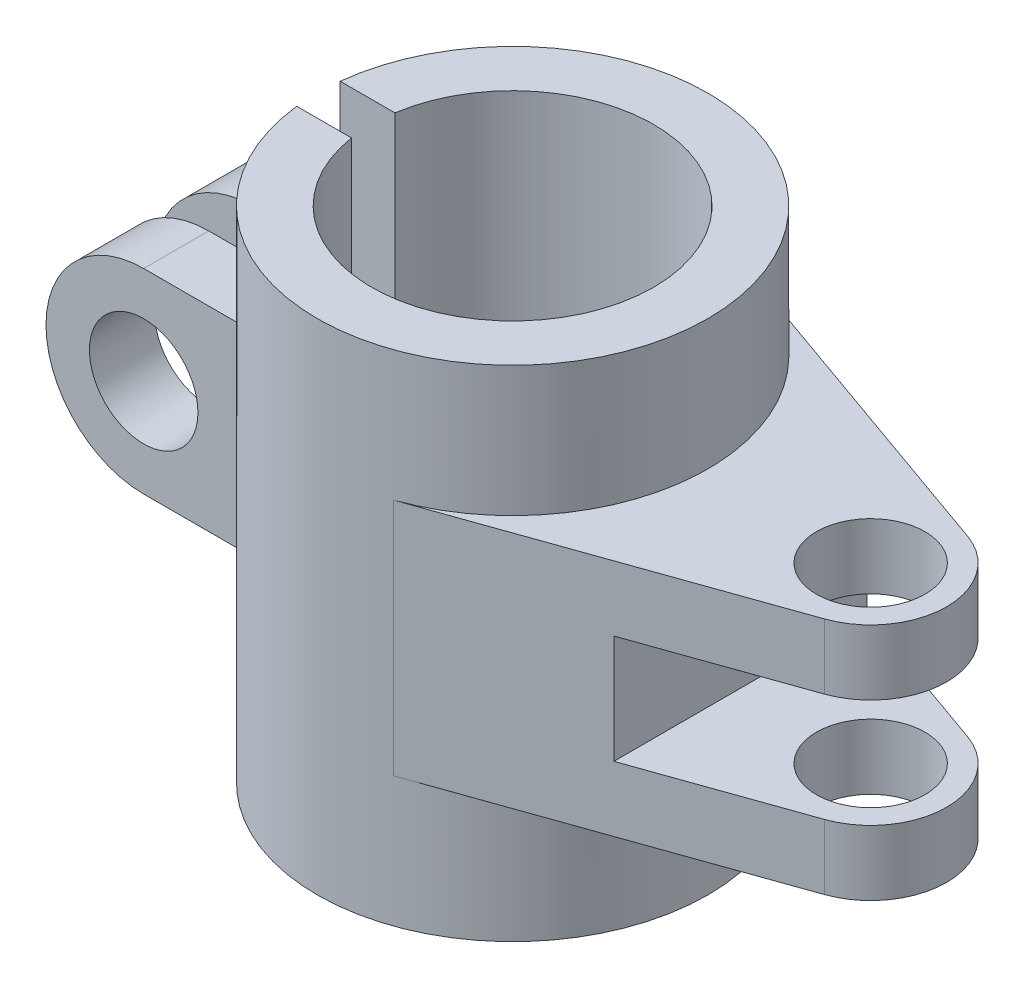
ISO-10303-21;
HEADER;
FILE_DESCRIPTION(('STEP AP214'),'2;1');
FILE_NAME('part.step','',(''),(''),'','','');
FILE_SCHEMA(('AUTOMOTIVE_DESIGN { 1 0 10303 214 1 1 1 1 }'));
ENDSEC;
DATA;
#1=APPLICATION_CONTEXT('core data for automotive mechanical design processes');
#2=APPLICATION_PROTOCOL_DEFINITION('international standard','automotive_design',2000,#1);
#3=PRODUCT_CONTEXT('',#1,'mechanical');
#4=PRODUCT('Part','Part','',(#3));
#5=PRODUCT_RELATED_PRODUCT_CATEGORY('part','',(#4));
#6=PRODUCT_DEFINITION_FORMATION('','',#4);
#7=PRODUCT_DEFINITION_CONTEXT('part definition',#1,'design');
#8=PRODUCT_DEFINITION('design','',#6,#7);
#9=PRODUCT_DEFINITION_SHAPE('','',#8);
#10=(LENGTH_UNIT() NAMED_UNIT(*) SI_UNIT(.MILLI.,.METRE.));
#11=(NAMED_UNIT(*) PLANE_ANGLE_UNIT() SI_UNIT($,.RADIAN.));
#12=(NAMED_UNIT(*) SI_UNIT($,.STERADIAN.) SOLID_ANGLE_UNIT());
#13=UNCERTAINTY_MEASURE_WITH_UNIT(LENGTH_MEASURE(1.E-05),#10,'distance_accuracy_value','');
#14=(GEOMETRIC_REPRESENTATION_CONTEXT(3) GLOBAL_UNCERTAINTY_ASSIGNED_CONTEXT((#13)) GLOBAL_UNIT_ASSIGNED_CONTEXT((#10,
#11,#12)) REPRESENTATION_CONTEXT('',''));
#15=CARTESIAN_POINT('',(0.,0.,0.));
#16=DIRECTION('',(0.,0.,1.));
#17=DIRECTION('',(1.,0.,0.));
#18=AXIS2_PLACEMENT_3D('',#15,#16,#17);
#19=CARTESIAN_POINT('',(120.655483362095,-12.,96.4309872342382));
#20=DIRECTION('',(0.,1.,0.));
#21=DIRECTION('',(0.,0.,1.));
#22=AXIS2_PLACEMENT_3D('',#19,#20,#21);
#23=PLANE('',#22);
#24=DIRECTION('',(0.942809041582064,0.,0.333333333333333));
#25=VECTOR('',#24,1.);
#26=CARTESIAN_POINT('',(111.067814877742,-12.,79.4604244857611));
#27=LINE('',#26,#25);
#28=CARTESIAN_POINT('',(111.067814877742,-12.,79.4604244857611));
#29=VERTEX_POINT('',#28);
#30=CARTESIAN_POINT('',(140.401148211075,-12.,89.8313239431638));
#31=VERTEX_POINT('',#30);
#32=EDGE_CURVE('E23',#29,#31,#27,.T.);
#33=ORIENTED_EDGE('',*,*,#32,.F.);
#34=CARTESIAN_POINT('',(105.067814877742,-12.,96.4309872342382));
#35=DIRECTION('',(0.,1.,0.));
#36=DIRECTION('',(0.333333333333332,0.,0.942809041582064));
#37=AXIS2_PLACEMENT_3D('',#34,#35,#36);
#38=CIRCLE('',#37,18.);
#39=CARTESIAN_POINT('',(111.067814877742,-12.,113.401549982715));
#40=VERTEX_POINT('',#39);
#41=EDGE_CURVE('E183',#40,#29,#38,.T.);
#42=ORIENTED_EDGE('',*,*,#41,.F.);
#43=DIRECTION('',(-0.942809041582063,0.,0.333333333333333));
#44=VECTOR('',#43,1.);
#45=CARTESIAN_POINT('',(140.401148211075,-12.,103.030650525313));
#46=LINE('',#45,#44);
#47=CARTESIAN_POINT('',(140.401148211075,-12.,103.030650525313));
#48=VERTEX_POINT('',#47);
#49=EDGE_CURVE('E345',#48,#40,#46,.T.);
#50=ORIENTED_EDGE('',*,*,#49,.F.);
#51=CARTESIAN_POINT('',(138.067814877742,-12.,96.4309872342382));
#52=DIRECTION('',(0.,-1.,0.));
#53=DIRECTION('',(0.333333333333339,0.,-0.942809041582062));
#54=AXIS2_PLACEMENT_3D('',#51,#52,#53);
#55=CIRCLE('',#54,7.);
#56=EDGE_CURVE('E264',#31,#48,#55,.T.);
#57=ORIENTED_EDGE('',*,*,#56,.F.);
#58=EDGE_LOOP('',(#33,#42,#50,#57));
#59=FACE_BOUND('',#58,.T.);
#60=CARTESIAN_POINT('',(138.067814877742,-12.,96.4309872342382));
#61=DIRECTION('',(0.,1.,0.));
#62=DIRECTION('',(1.,0.,0.));
#63=AXIS2_PLACEMENT_3D('',#60,#61,#62);
#64=CIRCLE('',#63,5.);
#65=CARTESIAN_POINT('',(133.067814877742,-12.,96.4309872342382));
#66=VERTEX_POINT('',#65);
#67=EDGE_CURVE('E256',#66,#66,#64,.T.);
#68=ORIENTED_EDGE('',*,*,#67,.F.);
#69=EDGE_LOOP('',(#68));
#70=FACE_BOUND('',#69,.T.);
#71=ADVANCED_FACE('F15',(#59,#70),#23,.T.);
#72=CARTESIAN_POINT('',(120.655483362095,-34.,96.4309872342382));
#73=DIRECTION('',(0.,1.,0.));
#74=DIRECTION('',(0.,0.,1.));
#75=AXIS2_PLACEMENT_3D('',#72,#73,#74);
#76=PLANE('',#75);
#77=DIRECTION('',(0.942809041582064,0.,0.333333333333333));
#78=VECTOR('',#77,1.);
#79=CARTESIAN_POINT('',(111.067814877742,-34.,79.4604244857611));
#80=LINE('',#79,#78);
#81=CARTESIAN_POINT('',(111.067814877742,-34.,79.4604244857611));
#82=VERTEX_POINT('',#81);
#83=CARTESIAN_POINT('',(140.401148211075,-34.,89.8313239431638));
#84=VERTEX_POINT('',#83);
#85=EDGE_CURVE('E9',#82,#84,#80,.T.);
#86=ORIENTED_EDGE('',*,*,#85,.T.);
#87=CARTESIAN_POINT('',(138.067814877742,-34.,96.4309872342382));
#88=DIRECTION('',(0.,-1.,0.));
#89=DIRECTION('',(0.333333333333339,0.,-0.942809041582062));
#90=AXIS2_PLACEMENT_3D('',#87,#88,#89);
#91=CIRCLE('',#90,7.);
#92=CARTESIAN_POINT('',(140.401148211075,-34.,103.030650525313));
#93=VERTEX_POINT('',#92);
#94=EDGE_CURVE('E219',#84,#93,#91,.T.);
#95=ORIENTED_EDGE('',*,*,#94,.T.);
#96=DIRECTION('',(-0.942809041582063,0.,0.333333333333333));
#97=VECTOR('',#96,1.);
#98=CARTESIAN_POINT('',(140.401148211075,-34.,103.030650525313));
#99=LINE('',#98,#97);
#100=CARTESIAN_POINT('',(111.067814877742,-34.,113.401549982715));
#101=VERTEX_POINT('',#100);
#102=EDGE_CURVE('E194',#93,#101,#99,.T.);
#103=ORIENTED_EDGE('',*,*,#102,.T.);
#104=CARTESIAN_POINT('',(105.067814877742,-34.,96.4309872342382));
#105=DIRECTION('',(0.,1.,0.));
#106=DIRECTION('',(0.333333333333332,0.,0.942809041582064));
#107=AXIS2_PLACEMENT_3D('',#104,#105,#106);
#108=CIRCLE('',#107,18.);
#109=EDGE_CURVE('E285',#101,#82,#108,.T.);
#110=ORIENTED_EDGE('',*,*,#109,.T.);
#111=EDGE_LOOP('',(#86,#95,#103,#110));
#112=FACE_BOUND('',#111,.T.);
#113=CARTESIAN_POINT('',(138.067814877742,-34.,96.4309872342382));
#114=DIRECTION('',(0.,1.,0.));
#115=DIRECTION('',(1.,0.,0.));
#116=AXIS2_PLACEMENT_3D('',#113,#114,#115);
#117=CIRCLE('',#116,5.);
#118=CARTESIAN_POINT('',(133.067814877742,-34.,96.4309872342382));
#119=VERTEX_POINT('',#118);
#120=EDGE_CURVE('E195',#119,#119,#117,.T.);
#121=ORIENTED_EDGE('',*,*,#120,.T.);
#122=EDGE_LOOP('',(#121));
#123=FACE_BOUND('',#122,.T.);
#124=ADVANCED_FACE('F342',(#112,#123),#76,.F.);
#125=CARTESIAN_POINT('',(111.067814877742,-12.,79.4604244857611));
#126=DIRECTION('',(0.333333333333333,0.,-0.942809041582064));
#127=DIRECTION('',(0.942809041582064,0.,0.333333333333333));
#128=AXIS2_PLACEMENT_3D('',#125,#126,#127);
#129=PLANE('',#128);
#130=ORIENTED_EDGE('',*,*,#32,.T.);
#131=DIRECTION('',(0.,-1.,0.));
#132=VECTOR('',#131,1.);
#133=CARTESIAN_POINT('',(140.401148211075,-12.,89.8313239431638));
#134=LINE('',#133,#132);
#135=CARTESIAN_POINT('',(140.401148211075,-18.,89.8313239431638));
#136=VERTEX_POINT('',#135);
#137=EDGE_CURVE('E277',#31,#136,#134,.T.);
#138=ORIENTED_EDGE('',*,*,#137,.T.);
#139=DIRECTION('',(0.942809041582063,0.,0.333333333333334));
#140=VECTOR('',#139,1.);
#141=CARTESIAN_POINT('',(126.067814877742,-18.,84.7637253446602));
#142=LINE('',#141,#140);
#143=CARTESIAN_POINT('',(126.067814877742,-18.,84.7637253446602));
#144=VERTEX_POINT('',#143);
#145=EDGE_CURVE('E276',#144,#136,#142,.T.);
#146=ORIENTED_EDGE('',*,*,#145,.F.);
#147=DIRECTION('',(0.,-1.,0.));
#148=VECTOR('',#147,1.);
#149=CARTESIAN_POINT('',(126.067814877742,-12.,84.7637253446602));
#150=LINE('',#149,#148);
#151=CARTESIAN_POINT('',(126.067814877742,-28.,84.7637253446602));
#152=VERTEX_POINT('',#151);
#153=EDGE_CURVE('E204',#144,#152,#150,.T.);
#154=ORIENTED_EDGE('',*,*,#153,.T.);
#155=DIRECTION('',(0.942809041582063,0.,0.333333333333334));
#156=VECTOR('',#155,1.);
#157=CARTESIAN_POINT('',(126.067814877742,-28.,84.7637253446602));
#158=LINE('',#157,#156);
#159=CARTESIAN_POINT('',(140.401148211075,-28.,89.8313239431638));
#160=VERTEX_POINT('',#159);
#161=EDGE_CURVE('E229',#152,#160,#158,.T.);
#162=ORIENTED_EDGE('',*,*,#161,.T.);
#163=DIRECTION('',(0.,-1.,0.));
#164=VECTOR('',#163,1.);
#165=CARTESIAN_POINT('',(140.401148211075,-28.,89.8313239431638));
#166=LINE('',#165,#164);
#167=EDGE_CURVE('E238',#160,#84,#166,.T.);
#168=ORIENTED_EDGE('',*,*,#167,.T.);
#169=ORIENTED_EDGE('',*,*,#85,.F.);
#170=DIRECTION('',(0.,-1.,0.));
#171=VECTOR('',#170,1.);
#172=CARTESIAN_POINT('',(111.067814877742,-12.,79.4604244857611));
#173=LINE('',#172,#171);
#174=EDGE_CURVE('E282',#29,#82,#173,.T.);
#175=ORIENTED_EDGE('',*,*,#174,.F.);
#176=EDGE_LOOP('',(#130,#138,#146,#154,#162,#168,#169,#175));
#177=FACE_BOUND('',#176,.T.);
#178=ADVANCED_FACE('F357',(#177),#129,.T.);
#179=CARTESIAN_POINT('',(126.067814877742,-12.,108.098249123816));
#180=DIRECTION('',(0.333333333333334,0.,0.942809041582063));
#181=DIRECTION('',(-0.942809041582063,0.,0.333333333333334));
#182=AXIS2_PLACEMENT_3D('',#179,#180,#181);
#183=PLANE('',#182);
#184=ORIENTED_EDGE('',*,*,#49,.T.);
#185=DIRECTION('',(0.,-1.,0.));
#186=VECTOR('',#185,1.);
#187=CARTESIAN_POINT('',(111.067814877742,-12.,113.401549982715));
#188=LINE('',#187,#186);
#189=EDGE_CURVE('E186',#40,#101,#188,.T.);
#190=ORIENTED_EDGE('',*,*,#189,.T.);
#191=ORIENTED_EDGE('',*,*,#102,.F.);
#192=DIRECTION('',(0.,-1.,0.));
#193=VECTOR('',#192,1.);
#194=CARTESIAN_POINT('',(140.401148211075,-28.,103.030650525313));
#195=LINE('',#194,#193);
#196=CARTESIAN_POINT('',(140.401148211075,-28.,103.030650525313));
#197=VERTEX_POINT('',#196);
#198=EDGE_CURVE('E220',#197,#93,#195,.T.);
#199=ORIENTED_EDGE('',*,*,#198,.F.);
#200=DIRECTION('',(-0.942809041582063,0.,0.333333333333333));
#201=VECTOR('',#200,1.);
#202=CARTESIAN_POINT('',(140.401148211075,-28.,103.030650525313));
#203=LINE('',#202,#201);
#204=CARTESIAN_POINT('',(126.067814877742,-28.,108.098249123816));
#205=VERTEX_POINT('',#204);
#206=EDGE_CURVE('E247',#197,#205,#203,.T.);
#207=ORIENTED_EDGE('',*,*,#206,.T.);
#208=DIRECTION('',(0.,-1.,0.));
#209=VECTOR('',#208,1.);
#210=CARTESIAN_POINT('',(126.067814877742,-12.,108.098249123816));
#211=LINE('',#210,#209);
#212=CARTESIAN_POINT('',(126.067814877742,-18.,108.098249123816));
#213=VERTEX_POINT('',#212);
#214=EDGE_CURVE('E201',#213,#205,#211,.T.);
#215=ORIENTED_EDGE('',*,*,#214,.F.);
#216=DIRECTION('',(-0.942809041582063,0.,0.333333333333333));
#217=VECTOR('',#216,1.);
#218=CARTESIAN_POINT('',(140.401148211075,-18.,103.030650525313));
#219=LINE('',#218,#217);
#220=CARTESIAN_POINT('',(140.401148211075,-18.,103.030650525313));
#221=VERTEX_POINT('',#220);
#222=EDGE_CURVE('E281',#221,#213,#219,.T.);
#223=ORIENTED_EDGE('',*,*,#222,.F.);
#224=DIRECTION('',(0.,-1.,0.));
#225=VECTOR('',#224,1.);
#226=CARTESIAN_POINT('',(140.401148211075,-12.,103.030650525313));
#227=LINE('',#226,#225);
#228=EDGE_CURVE('E268',#48,#221,#227,.T.);
#229=ORIENTED_EDGE('',*,*,#228,.F.);
#230=EDGE_LOOP('',(#184,#190,#191,#199,#207,#215,#223,#229));
#231=FACE_BOUND('',#230,.T.);
#232=ADVANCED_FACE('F351',(#231),#183,.T.);
#233=CARTESIAN_POINT('',(104.654905712878,0.,96.4309872342382));
#234=DIRECTION('',(0.,1.,0.));
#235=DIRECTION('',(0.,0.,1.));
#236=AXIS2_PLACEMENT_3D('',#233,#234,#235);
#237=PLANE('',#236);
#238=DIRECTION('',(-1.,0.,0.));
#239=VECTOR('',#238,1.);
#240=CARTESIAN_POINT('',(92.222582299077,0.,94.4309872342382));
#241=LINE('',#240,#239);
#242=CARTESIAN_POINT('',(92.222582299077,0.,94.4309872342382));
#243=VERTEX_POINT('',#242);
#244=CARTESIAN_POINT('',(87.1792710577439,0.,94.4309872342382));
#245=VERTEX_POINT('',#244);
#246=EDGE_CURVE('E159',#243,#245,#241,.T.);
#247=ORIENTED_EDGE('',*,*,#246,.F.);
#248=CARTESIAN_POINT('',(105.067814877742,0.,96.4309872342382));
#249=DIRECTION('',(0.,1.,0.));
#250=DIRECTION('',(-0.988094813743472,0.,0.153846153846154));
#251=AXIS2_PLACEMENT_3D('',#248,#249,#250);
#252=CIRCLE('',#251,13.);
#253=CARTESIAN_POINT('',(92.222582299077,0.,98.4309872342382));
#254=VERTEX_POINT('',#253);
#255=EDGE_CURVE('E163',#254,#243,#252,.T.);
#256=ORIENTED_EDGE('',*,*,#255,.F.);
#257=DIRECTION('',(1.,0.,0.));
#258=VECTOR('',#257,1.);
#259=CARTESIAN_POINT('',(87.1792710577439,0.,98.4309872342382));
#260=LINE('',#259,#258);
#261=CARTESIAN_POINT('',(87.1792710577439,0.,98.4309872342382));
#262=VERTEX_POINT('',#261);
#263=EDGE_CURVE('E269',#262,#254,#260,.T.);
#264=ORIENTED_EDGE('',*,*,#263,.F.);
#265=CARTESIAN_POINT('',(105.067814877742,0.,96.4309872342382));
#266=DIRECTION('',(0.,-1.,0.));
#267=DIRECTION('',(-0.993807989999906,0.,-0.111111111111111));
#268=AXIS2_PLACEMENT_3D('',#265,#266,#267);
#269=CIRCLE('',#268,18.);
#270=EDGE_CURVE('E167',#245,#262,#269,.T.);
#271=ORIENTED_EDGE('',*,*,#270,.F.);
#272=EDGE_LOOP('',(#247,#256,#264,#271));
#273=FACE_BOUND('',#272,.T.);
#274=ADVANCED_FACE('F165',(#273),#237,.T.);
#275=CARTESIAN_POINT('',(104.654905712878,-46.,96.4309872342382));
#276=DIRECTION('',(0.,1.,0.));
#277=DIRECTION('',(0.,0.,1.));
#278=AXIS2_PLACEMENT_3D('',#275,#276,#277);
#279=PLANE('',#278);
#280=DIRECTION('',(-1.,0.,0.));
#281=VECTOR('',#280,1.);
#282=CARTESIAN_POINT('',(92.222582299077,-46.,94.4309872342382));
#283=LINE('',#282,#281);
#284=CARTESIAN_POINT('',(92.222582299077,-46.,94.4309872342382));
#285=VERTEX_POINT('',#284);
#286=CARTESIAN_POINT('',(87.1792710577439,-46.,94.4309872342382));
#287=VERTEX_POINT('',#286);
#288=EDGE_CURVE('E166',#285,#287,#283,.T.);
#289=ORIENTED_EDGE('',*,*,#288,.T.);
#290=CARTESIAN_POINT('',(105.067814877742,-46.,96.4309872342382));
#291=DIRECTION('',(0.,-1.,0.));
#292=DIRECTION('',(-0.993807989999906,0.,-0.111111111111111));
#293=AXIS2_PLACEMENT_3D('',#290,#291,#292);
#294=CIRCLE('',#293,18.);
#295=CARTESIAN_POINT('',(87.1792710577439,-46.,98.4309872342382));
#296=VERTEX_POINT('',#295);
#297=EDGE_CURVE('E328',#287,#296,#294,.T.);
#298=ORIENTED_EDGE('',*,*,#297,.T.);
#299=DIRECTION('',(1.,0.,0.));
#300=VECTOR('',#299,1.);
#301=CARTESIAN_POINT('',(87.1792710577439,-46.,98.4309872342382));
#302=LINE('',#301,#300);
#303=CARTESIAN_POINT('',(92.222582299077,-46.,98.4309872342382));
#304=VERTEX_POINT('',#303);
#305=EDGE_CURVE('E28',#296,#304,#302,.T.);
#306=ORIENTED_EDGE('',*,*,#305,.T.);
#307=CARTESIAN_POINT('',(105.067814877742,-46.,96.4309872342382));
#308=DIRECTION('',(0.,1.,0.));
#309=DIRECTION('',(-0.988094813743472,0.,0.153846153846154));
#310=AXIS2_PLACEMENT_3D('',#307,#308,#309);
#311=CIRCLE('',#310,13.);
#312=EDGE_CURVE('E178',#304,#285,#311,.T.);
#313=ORIENTED_EDGE('',*,*,#312,.T.);
#314=EDGE_LOOP('',(#289,#298,#306,#313));
#315=FACE_BOUND('',#314,.T.);
#316=ADVANCED_FACE('F402',(#315),#279,.F.);
#317=CARTESIAN_POINT('',(92.222582299077,0.,94.4309872342382));
#318=DIRECTION('',(0.,0.,1.));
#319=DIRECTION('',(-1.,0.,0.));
#320=AXIS2_PLACEMENT_3D('',#317,#318,#319);
#321=PLANE('',#320);
#322=ORIENTED_EDGE('',*,*,#246,.T.);
#323=DIRECTION('',(0.,-1.,0.));
#324=VECTOR('',#323,1.);
#325=CARTESIAN_POINT('',(87.1792710577439,0.,94.4309872342382));
#326=LINE('',#325,#324);
#327=CARTESIAN_POINT('',(87.1792710577439,-14.,94.4309872342382));
#328=VERTEX_POINT('',#327);
#329=EDGE_CURVE('E334',#245,#328,#326,.T.);
#330=ORIENTED_EDGE('',*,*,#329,.T.);
#331=DIRECTION('',(-1.,0.,0.));
#332=VECTOR('',#331,1.);
#333=CARTESIAN_POINT('',(87.1792710577439,-14.,94.4309872342382));
#334=LINE('',#333,#332);
#335=CARTESIAN_POINT('',(79.0678148777422,-14.,94.4309872342382));
#336=VERTEX_POINT('',#335);
#337=EDGE_CURVE('E263',#328,#336,#334,.T.);
#338=ORIENTED_EDGE('',*,*,#337,.T.);
#339=CARTESIAN_POINT('',(79.0678148777422,-23.,94.4309872342382));
#340=DIRECTION('',(0.,0.,-1.));
#341=DIRECTION('',(-0.707106781186548,0.707106781186548,0.));
#342=AXIS2_PLACEMENT_3D('',#339,#340,#341);
#343=CIRCLE('',#342,9.);
#344=CARTESIAN_POINT('',(79.0678148777422,-32.,94.4309872342382));
#345=VERTEX_POINT('',#344);
#346=EDGE_CURVE('E223',#345,#336,#343,.T.);
#347=ORIENTED_EDGE('',*,*,#346,.F.);
#348=DIRECTION('',(-1.,0.,0.));
#349=VECTOR('',#348,1.);
#350=CARTESIAN_POINT('',(87.1792710577439,-32.,94.4309872342382));
#351=LINE('',#350,#349);
#352=CARTESIAN_POINT('',(87.1792710577439,-32.,94.4309872342382));
#353=VERTEX_POINT('',#352);
#354=EDGE_CURVE('E322',#353,#345,#351,.T.);
#355=ORIENTED_EDGE('',*,*,#354,.F.);
#356=DIRECTION('',(0.,-1.,0.));
#357=VECTOR('',#356,1.);
#358=CARTESIAN_POINT('',(87.1792710577439,0.,94.4309872342382));
#359=LINE('',#358,#357);
#360=EDGE_CURVE('E332',#353,#287,#359,.T.);
#361=ORIENTED_EDGE('',*,*,#360,.T.);
#362=ORIENTED_EDGE('',*,*,#288,.F.);
#363=DIRECTION('',(0.,-1.,0.));
#364=VECTOR('',#363,1.);
#365=CARTESIAN_POINT('',(92.222582299077,0.,94.4309872342382));
#366=LINE('',#365,#364);
#367=EDGE_CURVE('E172',#243,#285,#366,.T.);
#368=ORIENTED_EDGE('',*,*,#367,.F.);
#369=EDGE_LOOP('',(#322,#330,#338,#347,#355,#361,#362,#368));
#370=FACE_BOUND('',#369,.T.);
#371=CARTESIAN_POINT('',(79.0678148777419,-23.,94.4309872342382));
#372=DIRECTION('',(0.,0.,-1.));
#373=DIRECTION('',(0.,1.,0.));
#374=AXIS2_PLACEMENT_3D('',#371,#372,#373);
#375=CIRCLE('',#374,5.);
#376=CARTESIAN_POINT('',(79.0678148777419,-28.,94.4309872342382));
#377=VERTEX_POINT('',#376);
#378=EDGE_CURVE('E198',#377,#377,#375,.T.);
#379=ORIENTED_EDGE('',*,*,#378,.T.);
#380=EDGE_LOOP('',(#379));
#381=FACE_BOUND('',#380,.T.);
#382=ADVANCED_FACE('F174',(#370,#381),#321,.T.);
#383=CARTESIAN_POINT('',(87.1792710577439,0.,98.4309872342382));
#384=DIRECTION('',(0.,0.,-1.));
#385=DIRECTION('',(1.,0.,0.));
#386=AXIS2_PLACEMENT_3D('',#383,#384,#385);
#387=PLANE('',#386);
#388=ORIENTED_EDGE('',*,*,#263,.T.);
#389=DIRECTION('',(0.,-1.,0.));
#390=VECTOR('',#389,1.);
#391=CARTESIAN_POINT('',(92.222582299077,0.,98.4309872342382));
#392=LINE('',#391,#390);
#393=EDGE_CURVE('E181',#254,#304,#392,.T.);
#394=ORIENTED_EDGE('',*,*,#393,.T.);
#395=ORIENTED_EDGE('',*,*,#305,.F.);
#396=DIRECTION('',(0.,-1.,0.));
#397=VECTOR('',#396,1.);
#398=CARTESIAN_POINT('',(87.1792710577439,0.,98.4309872342382));
#399=LINE('',#398,#397);
#400=CARTESIAN_POINT('',(87.1792710577439,-32.,98.4309872342382));
#401=VERTEX_POINT('',#400);
#402=EDGE_CURVE('E265',#401,#296,#399,.T.);
#403=ORIENTED_EDGE('',*,*,#402,.F.);
#404=DIRECTION('',(1.,0.,0.));
#405=VECTOR('',#404,1.);
#406=CARTESIAN_POINT('',(70.0678148777422,-32.,98.4309872342382));
#407=LINE('',#406,#405);
#408=CARTESIAN_POINT('',(79.0678148777422,-32.,98.4309872342382));
#409=VERTEX_POINT('',#408);
#410=EDGE_CURVE('E233',#409,#401,#407,.T.);
#411=ORIENTED_EDGE('',*,*,#410,.F.);
#412=CARTESIAN_POINT('',(79.0678148777422,-23.,98.4309872342382));
#413=DIRECTION('',(0.,0.,1.));
#414=DIRECTION('',(-0.707106781186548,-0.707106781186548,0.));
#415=AXIS2_PLACEMENT_3D('',#412,#413,#414);
#416=CIRCLE('',#415,9.);
#417=CARTESIAN_POINT('',(79.0678148777422,-14.,98.4309872342382));
#418=VERTEX_POINT('',#417);
#419=EDGE_CURVE('E307',#418,#409,#416,.T.);
#420=ORIENTED_EDGE('',*,*,#419,.F.);
#421=DIRECTION('',(1.,0.,0.));
#422=VECTOR('',#421,1.);
#423=CARTESIAN_POINT('',(70.0678148777422,-14.,98.4309872342382));
#424=LINE('',#423,#422);
#425=CARTESIAN_POINT('',(87.1792710577439,-14.,98.4309872342382));
#426=VERTEX_POINT('',#425);
#427=EDGE_CURVE('E299',#418,#426,#424,.T.);
#428=ORIENTED_EDGE('',*,*,#427,.T.);
#429=DIRECTION('',(0.,-1.,0.));
#430=VECTOR('',#429,1.);
#431=CARTESIAN_POINT('',(87.1792710577439,0.,98.4309872342382));
#432=LINE('',#431,#430);
#433=EDGE_CURVE('E286',#262,#426,#432,.T.);
#434=ORIENTED_EDGE('',*,*,#433,.F.);
#435=EDGE_LOOP('',(#388,#394,#395,#403,#411,#420,#428,#434));
#436=FACE_BOUND('',#435,.T.);
#437=CARTESIAN_POINT('',(79.0678148777419,-23.,98.4309872342382));
#438=DIRECTION('',(0.,0.,1.));
#439=DIRECTION('',(0.,1.,0.));
#440=AXIS2_PLACEMENT_3D('',#437,#438,#439);
#441=CIRCLE('',#440,5.);
#442=CARTESIAN_POINT('',(79.0678148777419,-28.,98.4309872342382));
#443=VERTEX_POINT('',#442);
#444=EDGE_CURVE('E193',#443,#443,#441,.T.);
#445=ORIENTED_EDGE('',*,*,#444,.T.);
#446=EDGE_LOOP('',(#445));
#447=FACE_BOUND('',#446,.T.);
#448=ADVANCED_FACE('F393',(#436,#447),#387,.T.);
#449=CARTESIAN_POINT('',(105.067814877742,0.,96.4309872342382));
#450=DIRECTION('',(0.,1.,0.));
#451=DIRECTION('',(-0.988094813743472,0.,0.153846153846154));
#452=AXIS2_PLACEMENT_3D('',#449,#450,#451);
#453=CYLINDRICAL_SURFACE('',#452,13.);
#454=ORIENTED_EDGE('',*,*,#255,.T.);
#455=ORIENTED_EDGE('',*,*,#367,.T.);
#456=ORIENTED_EDGE('',*,*,#312,.F.);
#457=ORIENTED_EDGE('',*,*,#393,.F.);
#458=EDGE_LOOP('',(#454,#455,#456,#457));
#459=FACE_BOUND('',#458,.T.);
#460=ADVANCED_FACE('F185',(#459),#453,.F.);
#461=CARTESIAN_POINT('',(105.067814877742,0.,96.4309872342382));
#462=DIRECTION('',(0.,1.,0.));
#463=DIRECTION('',(-0.993807989999906,0.,-0.111111111111111));
#464=AXIS2_PLACEMENT_3D('',#461,#462,#463);
#465=CYLINDRICAL_SURFACE('',#464,18.);
#466=ORIENTED_EDGE('',*,*,#174,.T.);
#467=ORIENTED_EDGE('',*,*,#109,.F.);
#468=ORIENTED_EDGE('',*,*,#189,.F.);
#469=ORIENTED_EDGE('',*,*,#41,.T.);
#470=EDGE_LOOP('',(#466,#467,#468,#469));
#471=FACE_BOUND('',#470,.T.);
#472=CARTESIAN_POINT('',(105.067814877742,-32.,96.4309872342382));
#473=DIRECTION('',(0.,-1.,0.));
#474=DIRECTION('',(-0.993807989999906,0.,-0.111111111111111));
#475=AXIS2_PLACEMENT_3D('',#472,#473,#474);
#476=CIRCLE('',#475,18.);
#477=CARTESIAN_POINT('',(88.9432993811451,-32.,104.430987234238));
#478=VERTEX_POINT('',#477);
#479=EDGE_CURVE('E228',#478,#401,#476,.T.);
#480=ORIENTED_EDGE('',*,*,#479,.T.);
#481=ORIENTED_EDGE('',*,*,#402,.T.);
#482=ORIENTED_EDGE('',*,*,#297,.F.);
#483=ORIENTED_EDGE('',*,*,#360,.F.);
#484=CARTESIAN_POINT('',(105.067814877742,-32.,96.4309872342382));
#485=DIRECTION('',(0.,-1.,0.));
#486=DIRECTION('',(-0.993807989999906,0.,-0.111111111111111));
#487=AXIS2_PLACEMENT_3D('',#484,#485,#486);
#488=CIRCLE('',#487,18.);
#489=CARTESIAN_POINT('',(88.9432993811451,-32.,88.4309872342382));
#490=VERTEX_POINT('',#489);
#491=EDGE_CURVE('E221',#353,#490,#488,.T.);
#492=ORIENTED_EDGE('',*,*,#491,.T.);
#493=DIRECTION('',(0.,1.,0.));
#494=VECTOR('',#493,1.);
#495=CARTESIAN_POINT('',(88.9432993811451,0.,88.4309872342382));
#496=LINE('',#495,#494);
#497=CARTESIAN_POINT('',(88.9432993811451,-14.,88.4309872342382));
#498=VERTEX_POINT('',#497);
#499=EDGE_CURVE('E246',#490,#498,#496,.T.);
#500=ORIENTED_EDGE('',*,*,#499,.T.);
#501=CARTESIAN_POINT('',(105.067814877742,-14.,96.4309872342382));
#502=DIRECTION('',(0.,1.,0.));
#503=DIRECTION('',(-0.993807989999906,0.,-0.111111111111111));
#504=AXIS2_PLACEMENT_3D('',#501,#502,#503);
#505=CIRCLE('',#504,18.);
#506=EDGE_CURVE('E259',#498,#328,#505,.T.);
#507=ORIENTED_EDGE('',*,*,#506,.T.);
#508=ORIENTED_EDGE('',*,*,#329,.F.);
#509=ORIENTED_EDGE('',*,*,#270,.T.);
#510=ORIENTED_EDGE('',*,*,#433,.T.);
#511=CARTESIAN_POINT('',(105.067814877742,-14.,96.4309872342382));
#512=DIRECTION('',(0.,1.,0.));
#513=DIRECTION('',(-0.993807989999906,0.,-0.111111111111111));
#514=AXIS2_PLACEMENT_3D('',#511,#512,#513);
#515=CIRCLE('',#514,18.);
#516=CARTESIAN_POINT('',(88.9432993811451,-14.,104.430987234238));
#517=VERTEX_POINT('',#516);
#518=EDGE_CURVE('E296',#426,#517,#515,.T.);
#519=ORIENTED_EDGE('',*,*,#518,.T.);
#520=DIRECTION('',(0.,-1.,0.));
#521=VECTOR('',#520,1.);
#522=CARTESIAN_POINT('',(88.9432993811451,0.,104.430987234238));
#523=LINE('',#522,#521);
#524=EDGE_CURVE('E212',#517,#478,#523,.T.);
#525=ORIENTED_EDGE('',*,*,#524,.T.);
#526=EDGE_LOOP('',(#480,#481,#482,#483,#492,#500,#507,#508,#509,#510,#519,#525));
#527=FACE_BOUND('',#526,.T.);
#528=ADVANCED_FACE('F354',(#471,#527),#465,.T.);
#529=CARTESIAN_POINT('',(78.8158778905681,-14.,91.3124768295071));
#530=DIRECTION('',(0.,1.,0.));
#531=DIRECTION('',(0.,0.,1.));
#532=AXIS2_PLACEMENT_3D('',#529,#530,#531);
#533=PLANE('',#532);
#534=DIRECTION('',(0.,0.,-1.));
#535=VECTOR('',#534,1.);
#536=CARTESIAN_POINT('',(79.0678148777422,-14.,92.8717320318727));
#537=LINE('',#536,#535);
#538=CARTESIAN_POINT('',(79.0678148777422,-14.,88.4309872342382));
#539=VERTEX_POINT('',#538);
#540=EDGE_CURVE('E225',#336,#539,#537,.T.);
#541=ORIENTED_EDGE('',*,*,#540,.F.);
#542=ORIENTED_EDGE('',*,*,#337,.F.);
#543=ORIENTED_EDGE('',*,*,#506,.F.);
#544=DIRECTION('',(1.,0.,0.));
#545=VECTOR('',#544,1.);
#546=CARTESIAN_POINT('',(70.0678148777422,-14.,88.4309872342382));
#547=LINE('',#546,#545);
#548=EDGE_CURVE('E316',#539,#498,#547,.T.);
#549=ORIENTED_EDGE('',*,*,#548,.F.);
#550=EDGE_LOOP('',(#541,#542,#543,#549));
#551=FACE_BOUND('',#550,.T.);
#552=ADVANCED_FACE('F445',(#551),#533,.T.);
#553=CARTESIAN_POINT('',(78.8158778905681,-32.,91.3124768295071));
#554=DIRECTION('',(0.,1.,0.));
#555=DIRECTION('',(0.,0.,1.));
#556=AXIS2_PLACEMENT_3D('',#553,#554,#555);
#557=PLANE('',#556);
#558=DIRECTION('',(0.,0.,1.));
#559=VECTOR('',#558,1.);
#560=CARTESIAN_POINT('',(79.0678148777422,-32.,92.8717320318727));
#561=LINE('',#560,#559);
#562=CARTESIAN_POINT('',(79.0678148777422,-32.,88.4309872342382));
#563=VERTEX_POINT('',#562);
#564=EDGE_CURVE('E244',#563,#345,#561,.T.);
#565=ORIENTED_EDGE('',*,*,#564,.F.);
#566=DIRECTION('',(1.,0.,0.));
#567=VECTOR('',#566,1.);
#568=CARTESIAN_POINT('',(70.0678148777422,-32.,88.4309872342382));
#569=LINE('',#568,#567);
#570=EDGE_CURVE('E245',#563,#490,#569,.T.);
#571=ORIENTED_EDGE('',*,*,#570,.T.);
#572=ORIENTED_EDGE('',*,*,#491,.F.);
#573=ORIENTED_EDGE('',*,*,#354,.T.);
#574=EDGE_LOOP('',(#565,#571,#572,#573));
#575=FACE_BOUND('',#574,.T.);
#576=ADVANCED_FACE('F437',(#575),#557,.F.);
#577=CARTESIAN_POINT('',(79.0678148777422,-23.,92.8717320318727));
#578=DIRECTION('',(0.,0.,1.));
#579=DIRECTION('',(-0.707106781186548,-0.707106781186548,0.));
#580=AXIS2_PLACEMENT_3D('',#577,#578,#579);
#581=CYLINDRICAL_SURFACE('',#580,9.);
#582=CARTESIAN_POINT('',(79.0678148777422,-23.,88.4309872342382));
#583=DIRECTION('',(0.,0.,1.));
#584=DIRECTION('',(-0.707106781186548,-0.707106781186548,0.));
#585=AXIS2_PLACEMENT_3D('',#582,#583,#584);
#586=CIRCLE('',#585,9.);
#587=EDGE_CURVE('E235',#539,#563,#586,.T.);
#588=ORIENTED_EDGE('',*,*,#587,.T.);
#589=ORIENTED_EDGE('',*,*,#564,.T.);
#590=ORIENTED_EDGE('',*,*,#346,.T.);
#591=ORIENTED_EDGE('',*,*,#540,.T.);
#592=EDGE_LOOP('',(#588,#589,#590,#591));
#593=FACE_BOUND('',#592,.T.);
#594=ADVANCED_FACE('F442',(#593),#581,.T.);
#595=CARTESIAN_POINT('',(70.0678148777422,-14.,88.4309872342382));
#596=DIRECTION('',(0.,0.,-1.));
#597=DIRECTION('',(1.,0.,0.));
#598=AXIS2_PLACEMENT_3D('',#595,#596,#597);
#599=PLANE('',#598);
#600=ORIENTED_EDGE('',*,*,#587,.F.);
#601=ORIENTED_EDGE('',*,*,#548,.T.);
#602=ORIENTED_EDGE('',*,*,#499,.F.);
#603=ORIENTED_EDGE('',*,*,#570,.F.);
#604=EDGE_LOOP('',(#600,#601,#602,#603));
#605=FACE_BOUND('',#604,.T.);
#606=CARTESIAN_POINT('',(79.0678148777419,-23.,88.4309872342382));
#607=DIRECTION('',(0.,0.,1.));
#608=DIRECTION('',(0.,1.,0.));
#609=AXIS2_PLACEMENT_3D('',#606,#607,#608);
#610=CIRCLE('',#609,5.);
#611=CARTESIAN_POINT('',(79.0678148777419,-28.,88.4309872342382));
#612=VERTEX_POINT('',#611);
#613=EDGE_CURVE('E200',#612,#612,#610,.T.);
#614=ORIENTED_EDGE('',*,*,#613,.T.);
#615=EDGE_LOOP('',(#614));
#616=FACE_BOUND('',#615,.T.);
#617=ADVANCED_FACE('F441',(#605,#616),#599,.T.);
#618=CARTESIAN_POINT('',(78.8158778905681,-32.,101.549497638969));
#619=DIRECTION('',(0.,-1.,0.));
#620=DIRECTION('',(0.,0.,-1.));
#621=AXIS2_PLACEMENT_3D('',#618,#619,#620);
#622=PLANE('',#621);
#623=DIRECTION('',(0.,0.,1.));
#624=VECTOR('',#623,1.);
#625=CARTESIAN_POINT('',(79.0678148777422,-32.,102.990242436604));
#626=LINE('',#625,#624);
#627=CARTESIAN_POINT('',(79.0678148777422,-32.,104.430987234238));
#628=VERTEX_POINT('',#627);
#629=EDGE_CURVE('E309',#409,#628,#626,.T.);
#630=ORIENTED_EDGE('',*,*,#629,.F.);
#631=ORIENTED_EDGE('',*,*,#410,.T.);
#632=ORIENTED_EDGE('',*,*,#479,.F.);
#633=DIRECTION('',(-1.,0.,0.));
#634=VECTOR('',#633,1.);
#635=CARTESIAN_POINT('',(88.9432993811451,-32.,104.430987234238));
#636=LINE('',#635,#634);
#637=EDGE_CURVE('E211',#478,#628,#636,.T.);
#638=ORIENTED_EDGE('',*,*,#637,.T.);
#639=EDGE_LOOP('',(#630,#631,#632,#638));
#640=FACE_BOUND('',#639,.T.);
#641=ADVANCED_FACE('F447',(#640),#622,.T.);
#642=CARTESIAN_POINT('',(79.0678148777422,-23.,102.990242436604));
#643=DIRECTION('',(0.,0.,1.));
#644=DIRECTION('',(-0.707106781186548,-0.707106781186548,0.));
#645=AXIS2_PLACEMENT_3D('',#642,#643,#644);
#646=CYLINDRICAL_SURFACE('',#645,9.);
#647=ORIENTED_EDGE('',*,*,#419,.T.);
#648=ORIENTED_EDGE('',*,*,#629,.T.);
#649=CARTESIAN_POINT('',(79.0678148777422,-23.,104.430987234238));
#650=DIRECTION('',(0.,0.,-1.));
#651=DIRECTION('',(-0.707106781186548,0.707106781186548,0.));
#652=AXIS2_PLACEMENT_3D('',#649,#650,#651);
#653=CIRCLE('',#652,9.);
#654=CARTESIAN_POINT('',(79.0678148777422,-14.,104.430987234238));
#655=VERTEX_POINT('',#654);
#656=EDGE_CURVE('E214',#628,#655,#653,.T.);
#657=ORIENTED_EDGE('',*,*,#656,.T.);
#658=DIRECTION('',(0.,0.,-1.));
#659=VECTOR('',#658,1.);
#660=CARTESIAN_POINT('',(79.0678148777422,-14.,102.990242436604));
#661=LINE('',#660,#659);
#662=EDGE_CURVE('E287',#655,#418,#661,.T.);
#663=ORIENTED_EDGE('',*,*,#662,.T.);
#664=EDGE_LOOP('',(#647,#648,#657,#663));
#665=FACE_BOUND('',#664,.T.);
#666=ADVANCED_FACE('F451',(#665),#646,.T.);
#667=CARTESIAN_POINT('',(88.9432993811451,-14.,104.430987234238));
#668=DIRECTION('',(0.,0.,1.));
#669=DIRECTION('',(-1.,0.,0.));
#670=AXIS2_PLACEMENT_3D('',#667,#668,#669);
#671=PLANE('',#670);
#672=ORIENTED_EDGE('',*,*,#656,.F.);
#673=ORIENTED_EDGE('',*,*,#637,.F.);
#674=ORIENTED_EDGE('',*,*,#524,.F.);
#675=DIRECTION('',(-1.,0.,0.));
#676=VECTOR('',#675,1.);
#677=CARTESIAN_POINT('',(88.9432993811451,-14.,104.430987234238));
#678=LINE('',#677,#676);
#679=EDGE_CURVE('E292',#517,#655,#678,.T.);
#680=ORIENTED_EDGE('',*,*,#679,.T.);
#681=EDGE_LOOP('',(#672,#673,#674,#680));
#682=FACE_BOUND('',#681,.T.);
#683=CARTESIAN_POINT('',(79.0678148777419,-23.,104.430987234238));
#684=DIRECTION('',(0.,0.,-1.));
#685=DIRECTION('',(0.,1.,0.));
#686=AXIS2_PLACEMENT_3D('',#683,#684,#685);
#687=CIRCLE('',#686,5.);
#688=CARTESIAN_POINT('',(79.0678148777419,-18.,104.430987234238));
#689=VERTEX_POINT('',#688);
#690=EDGE_CURVE('E188',#689,#689,#687,.T.);
#691=ORIENTED_EDGE('',*,*,#690,.T.);
#692=EDGE_LOOP('',(#691));
#693=FACE_BOUND('',#692,.T.);
#694=ADVANCED_FACE('F383',(#682,#693),#671,.T.);
#695=CARTESIAN_POINT('',(78.8158778905681,-14.,101.549497638969));
#696=DIRECTION('',(0.,-1.,0.));
#697=DIRECTION('',(0.,0.,-1.));
#698=AXIS2_PLACEMENT_3D('',#695,#696,#697);
#699=PLANE('',#698);
#700=ORIENTED_EDGE('',*,*,#662,.F.);
#701=ORIENTED_EDGE('',*,*,#679,.F.);
#702=ORIENTED_EDGE('',*,*,#518,.F.);
#703=ORIENTED_EDGE('',*,*,#427,.F.);
#704=EDGE_LOOP('',(#700,#701,#702,#703));
#705=FACE_BOUND('',#704,.T.);
#706=ADVANCED_FACE('F424',(#705),#699,.F.);
#707=CARTESIAN_POINT('',(133.280847794519,-18.,96.4309872342382));
#708=DIRECTION('',(0.,-1.,0.));
#709=DIRECTION('',(0.,0.,-1.));
#710=AXIS2_PLACEMENT_3D('',#707,#708,#709);
#711=PLANE('',#710);
#712=DIRECTION('',(0.,0.,1.));
#713=VECTOR('',#712,1.);
#714=CARTESIAN_POINT('',(126.067814877742,-18.,90.5973562894492));
#715=LINE('',#714,#713);
#716=EDGE_CURVE('E199',#144,#213,#715,.T.);
#717=ORIENTED_EDGE('',*,*,#716,.F.);
#718=ORIENTED_EDGE('',*,*,#145,.T.);
#719=CARTESIAN_POINT('',(138.067814877742,-18.,96.4309872342382));
#720=DIRECTION('',(0.,-1.,0.));
#721=DIRECTION('',(0.333333333333339,0.,-0.942809041582062));
#722=AXIS2_PLACEMENT_3D('',#719,#720,#721);
#723=CIRCLE('',#722,7.);
#724=EDGE_CURVE('E272',#136,#221,#723,.T.);
#725=ORIENTED_EDGE('',*,*,#724,.T.);
#726=ORIENTED_EDGE('',*,*,#222,.T.);
#727=EDGE_LOOP('',(#717,#718,#725,#726));
#728=FACE_BOUND('',#727,.T.);
#729=CARTESIAN_POINT('',(138.067814877742,-18.,96.4309872342382));
#730=DIRECTION('',(0.,1.,0.));
#731=DIRECTION('',(1.,0.,0.));
#732=AXIS2_PLACEMENT_3D('',#729,#730,#731);
#733=CIRCLE('',#732,5.);
#734=CARTESIAN_POINT('',(133.067814877742,-18.,96.4309872342382));
#735=VERTEX_POINT('',#734);
#736=EDGE_CURVE('E253',#735,#735,#733,.T.);
#737=ORIENTED_EDGE('',*,*,#736,.T.);
#738=EDGE_LOOP('',(#737));
#739=FACE_BOUND('',#738,.T.);
#740=ADVANCED_FACE('F425',(#728,#739),#711,.T.);
#741=CARTESIAN_POINT('',(138.067814877742,-12.,96.4309872342382));
#742=DIRECTION('',(0.,1.,0.));
#743=DIRECTION('',(0.333333333333339,0.,-0.942809041582062));
#744=AXIS2_PLACEMENT_3D('',#741,#742,#743);
#745=CYLINDRICAL_SURFACE('',#744,7.);
#746=ORIENTED_EDGE('',*,*,#56,.T.);
#747=ORIENTED_EDGE('',*,*,#228,.T.);
#748=ORIENTED_EDGE('',*,*,#724,.F.);
#749=ORIENTED_EDGE('',*,*,#137,.F.);
#750=EDGE_LOOP('',(#746,#747,#748,#749));
#751=FACE_BOUND('',#750,.T.);
#752=ADVANCED_FACE('F416',(#751),#745,.T.);
#753=CARTESIAN_POINT('',(138.067814877742,-12.,96.4309872342382));
#754=DIRECTION('',(0.,1.,0.));
#755=DIRECTION('',(1.,0.,0.));
#756=AXIS2_PLACEMENT_3D('',#753,#754,#755);
#757=CYLINDRICAL_SURFACE('',#756,5.);
#758=ORIENTED_EDGE('',*,*,#67,.T.);
#759=EDGE_LOOP('',(#758));
#760=FACE_BOUND('',#759,.T.);
#761=ORIENTED_EDGE('',*,*,#736,.F.);
#762=EDGE_LOOP('',(#761));
#763=FACE_BOUND('',#762,.T.);
#764=ADVANCED_FACE('F414',(#760,#763),#757,.F.);
#765=CARTESIAN_POINT('',(126.067814877742,-12.,84.7637253446602));
#766=DIRECTION('',(1.,0.,0.));
#767=DIRECTION('',(0.,0.,1.));
#768=AXIS2_PLACEMENT_3D('',#765,#766,#767);
#769=PLANE('',#768);
#770=DIRECTION('',(0.,0.,-1.));
#771=VECTOR('',#770,1.);
#772=CARTESIAN_POINT('',(126.067814877742,-28.,90.5973562894492));
#773=LINE('',#772,#771);
#774=EDGE_CURVE('E241',#205,#152,#773,.T.);
#775=ORIENTED_EDGE('',*,*,#774,.T.);
#776=ORIENTED_EDGE('',*,*,#153,.F.);
#777=ORIENTED_EDGE('',*,*,#716,.T.);
#778=ORIENTED_EDGE('',*,*,#214,.T.);
#779=EDGE_LOOP('',(#775,#776,#777,#778));
#780=FACE_BOUND('',#779,.T.);
#781=ADVANCED_FACE('F373',(#780),#769,.T.);
#782=CARTESIAN_POINT('',(133.280847794519,-28.,96.4309872342382));
#783=DIRECTION('',(0.,-1.,0.));
#784=DIRECTION('',(0.,0.,-1.));
#785=AXIS2_PLACEMENT_3D('',#782,#783,#784);
#786=PLANE('',#785);
#787=ORIENTED_EDGE('',*,*,#774,.F.);
#788=ORIENTED_EDGE('',*,*,#206,.F.);
#789=CARTESIAN_POINT('',(138.067814877742,-28.,96.4309872342382));
#790=DIRECTION('',(0.,-1.,0.));
#791=DIRECTION('',(0.333333333333339,0.,-0.942809041582062));
#792=AXIS2_PLACEMENT_3D('',#789,#790,#791);
#793=CIRCLE('',#792,7.);
#794=EDGE_CURVE('E209',#160,#197,#793,.T.);
#795=ORIENTED_EDGE('',*,*,#794,.F.);
#796=ORIENTED_EDGE('',*,*,#161,.F.);
#797=EDGE_LOOP('',(#787,#788,#795,#796));
#798=FACE_BOUND('',#797,.T.);
#799=CARTESIAN_POINT('',(138.067814877742,-28.,96.4309872342382));
#800=DIRECTION('',(0.,1.,0.));
#801=DIRECTION('',(1.,0.,0.));
#802=AXIS2_PLACEMENT_3D('',#799,#800,#801);
#803=CIRCLE('',#802,5.);
#804=CARTESIAN_POINT('',(133.067814877742,-28.,96.4309872342382));
#805=VERTEX_POINT('',#804);
#806=EDGE_CURVE('E210',#805,#805,#803,.T.);
#807=ORIENTED_EDGE('',*,*,#806,.F.);
#808=EDGE_LOOP('',(#807));
#809=FACE_BOUND('',#808,.T.);
#810=ADVANCED_FACE('F369',(#798,#809),#786,.F.);
#811=CARTESIAN_POINT('',(138.067814877742,-28.,96.4309872342382));
#812=DIRECTION('',(0.,1.,0.));
#813=DIRECTION('',(0.333333333333339,0.,-0.942809041582062));
#814=AXIS2_PLACEMENT_3D('',#811,#812,#813);
#815=CYLINDRICAL_SURFACE('',#814,7.);
#816=ORIENTED_EDGE('',*,*,#794,.T.);
#817=ORIENTED_EDGE('',*,*,#198,.T.);
#818=ORIENTED_EDGE('',*,*,#94,.F.);
#819=ORIENTED_EDGE('',*,*,#167,.F.);
#820=EDGE_LOOP('',(#816,#817,#818,#819));
#821=FACE_BOUND('',#820,.T.);
#822=ADVANCED_FACE('F364',(#821),#815,.T.);
#823=CARTESIAN_POINT('',(138.067814877742,-28.,96.4309872342382));
#824=DIRECTION('',(0.,1.,0.));
#825=DIRECTION('',(1.,0.,0.));
#826=AXIS2_PLACEMENT_3D('',#823,#824,#825);
#827=CYLINDRICAL_SURFACE('',#826,5.);
#828=ORIENTED_EDGE('',*,*,#806,.T.);
#829=EDGE_LOOP('',(#828));
#830=FACE_BOUND('',#829,.T.);
#831=ORIENTED_EDGE('',*,*,#120,.F.);
#832=EDGE_LOOP('',(#831));
#833=FACE_BOUND('',#832,.T.);
#834=ADVANCED_FACE('F388',(#830,#833),#827,.F.);
#835=CARTESIAN_POINT('',(79.0678148777419,-23.,104.430987234238));
#836=DIRECTION('',(0.,0.,1.));
#837=DIRECTION('',(0.,1.,0.));
#838=AXIS2_PLACEMENT_3D('',#835,#836,#837);
#839=CYLINDRICAL_SURFACE('',#838,5.);
#840=ORIENTED_EDGE('',*,*,#690,.F.);
#841=EDGE_LOOP('',(#840));
#842=FACE_BOUND('',#841,.T.);
#843=ORIENTED_EDGE('',*,*,#444,.F.);
#844=EDGE_LOOP('',(#843));
#845=FACE_BOUND('',#844,.T.);
#846=ADVANCED_FACE('F387',(#842,#845),#839,.F.);
#847=CARTESIAN_POINT('',(79.0678148777419,-23.,104.430987234238));
#848=DIRECTION('',(0.,0.,1.));
#849=DIRECTION('',(0.,1.,0.));
#850=AXIS2_PLACEMENT_3D('',#847,#848,#849);
#851=CYLINDRICAL_SURFACE('',#850,5.);
#852=ORIENTED_EDGE('',*,*,#613,.F.);
#853=EDGE_LOOP('',(#852));
#854=FACE_BOUND('',#853,.T.);
#855=ORIENTED_EDGE('',*,*,#378,.F.);
#856=EDGE_LOOP('',(#855));
#857=FACE_BOUND('',#856,.T.);
#858=ADVANCED_FACE('F386',(#854,#857),#851,.F.);
#859=CLOSED_SHELL('',(#71,#124,#178,#232,#274,#316,#382,#448,#460,#528,#552,#576,#594,#617,#641,
#666,#694,#706,#740,#752,#764,#781,#810,#822,#834,#846,#858));
#860=MANIFOLD_SOLID_BREP('B1',#859);
#861=ADVANCED_BREP_SHAPE_REPRESENTATION('',(#18,#860),#14);
#862=SHAPE_DEFINITION_REPRESENTATION(#9,#861);
ENDSEC;
END-ISO-10303-21;
